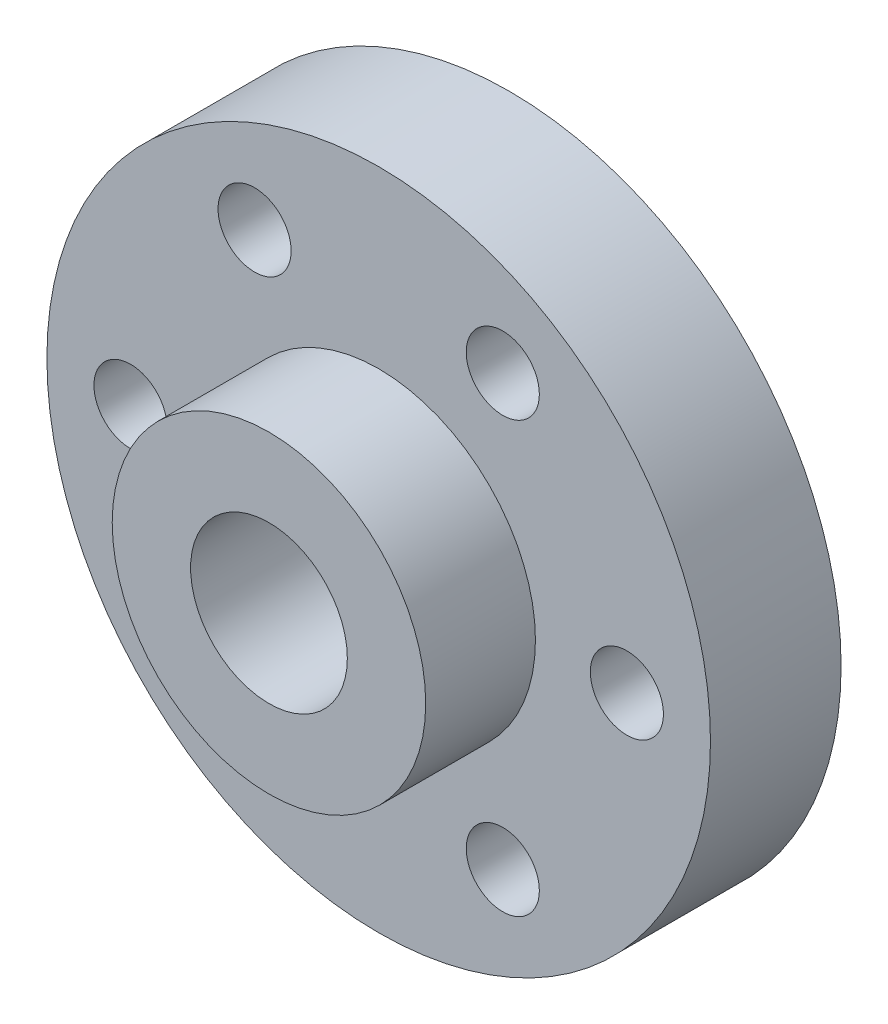
ISO-10303-21;
HEADER;
FILE_DESCRIPTION(('STEP AP214'),'2;1');
FILE_NAME('part.step','',(''),(''),'','','');
FILE_SCHEMA(('AUTOMOTIVE_DESIGN { 1 0 10303 214 1 1 1 1 }'));
ENDSEC;
DATA;
#1=APPLICATION_CONTEXT('core data for automotive mechanical design processes');
#2=APPLICATION_PROTOCOL_DEFINITION('international standard','automotive_design',2000,#1);
#3=PRODUCT_CONTEXT('',#1,'mechanical');
#4=PRODUCT('Part','Part','',(#3));
#5=PRODUCT_RELATED_PRODUCT_CATEGORY('part','',(#4));
#6=PRODUCT_DEFINITION_FORMATION('','',#4);
#7=PRODUCT_DEFINITION_CONTEXT('part definition',#1,'design');
#8=PRODUCT_DEFINITION('design','',#6,#7);
#9=PRODUCT_DEFINITION_SHAPE('','',#8);
#10=(LENGTH_UNIT() NAMED_UNIT(*) SI_UNIT(.MILLI.,.METRE.));
#11=(NAMED_UNIT(*) PLANE_ANGLE_UNIT() SI_UNIT($,.RADIAN.));
#12=(NAMED_UNIT(*) SI_UNIT($,.STERADIAN.) SOLID_ANGLE_UNIT());
#13=UNCERTAINTY_MEASURE_WITH_UNIT(LENGTH_MEASURE(1.E-05),#10,'distance_accuracy_value','');
#14=(GEOMETRIC_REPRESENTATION_CONTEXT(3) GLOBAL_UNCERTAINTY_ASSIGNED_CONTEXT((#13)) GLOBAL_UNIT_ASSIGNED_CONTEXT((#10,
#11,#12)) REPRESENTATION_CONTEXT('',''));
#15=CARTESIAN_POINT('',(0.,0.,0.));
#16=DIRECTION('',(0.,0.,1.));
#17=DIRECTION('',(1.,0.,0.));
#18=AXIS2_PLACEMENT_3D('',#15,#16,#17);
#19=CARTESIAN_POINT('',(9.5,0.,-5.));
#20=DIRECTION('',(0.,0.,1.));
#21=DIRECTION('',(1.,0.,0.));
#22=AXIS2_PLACEMENT_3D('',#19,#20,#21);
#23=CYLINDRICAL_SURFACE('',#22,1.39954);
#24=CARTESIAN_POINT('',(9.5,0.,-5.));
#25=DIRECTION('',(0.,0.,1.));
#26=DIRECTION('',(1.,0.,0.));
#27=AXIS2_PLACEMENT_3D('',#24,#25,#26);
#28=CIRCLE('',#27,1.39954);
#29=CARTESIAN_POINT('',(10.89954,0.,-5.));
#30=VERTEX_POINT('',#29);
#31=EDGE_CURVE('E39',#30,#30,#28,.T.);
#32=ORIENTED_EDGE('',*,*,#31,.F.);
#33=EDGE_LOOP('',(#32));
#34=FACE_BOUND('',#33,.T.);
#35=CARTESIAN_POINT('',(9.5,0.,0.));
#36=DIRECTION('',(0.,0.,1.));
#37=DIRECTION('',(1.,0.,0.));
#38=AXIS2_PLACEMENT_3D('',#35,#36,#37);
#39=CIRCLE('',#38,1.39954);
#40=CARTESIAN_POINT('',(10.89954,0.,0.));
#41=VERTEX_POINT('',#40);
#42=EDGE_CURVE('E64',#41,#41,#39,.T.);
#43=ORIENTED_EDGE('',*,*,#42,.T.);
#44=EDGE_LOOP('',(#43));
#45=FACE_BOUND('',#44,.T.);
#46=ADVANCED_FACE('F31',(#34,#45),#23,.F.);
#47=CARTESIAN_POINT('',(4.74999999999998,-8.22724133595218,-5.));
#48=DIRECTION('',(0.,0.,1.));
#49=DIRECTION('',(1.,0.,0.));
#50=AXIS2_PLACEMENT_3D('',#47,#48,#49);
#51=CYLINDRICAL_SURFACE('',#50,1.39954);
#52=CARTESIAN_POINT('',(4.74999999999998,-8.22724133595218,-5.));
#53=DIRECTION('',(0.,0.,1.));
#54=DIRECTION('',(1.,0.,0.));
#55=AXIS2_PLACEMENT_3D('',#52,#53,#54);
#56=CIRCLE('',#55,1.39954);
#57=CARTESIAN_POINT('',(6.14953999999998,-8.22724133595218,-5.));
#58=VERTEX_POINT('',#57);
#59=EDGE_CURVE('E44',#58,#58,#56,.T.);
#60=ORIENTED_EDGE('',*,*,#59,.F.);
#61=EDGE_LOOP('',(#60));
#62=FACE_BOUND('',#61,.T.);
#63=CARTESIAN_POINT('',(4.74999999999998,-8.22724133595218,0.));
#64=DIRECTION('',(0.,0.,1.));
#65=DIRECTION('',(1.,0.,0.));
#66=AXIS2_PLACEMENT_3D('',#63,#64,#65);
#67=CIRCLE('',#66,1.39954);
#68=CARTESIAN_POINT('',(6.14953999999998,-8.22724133595218,0.));
#69=VERTEX_POINT('',#68);
#70=EDGE_CURVE('E61',#69,#69,#67,.T.);
#71=ORIENTED_EDGE('',*,*,#70,.T.);
#72=EDGE_LOOP('',(#71));
#73=FACE_BOUND('',#72,.T.);
#74=ADVANCED_FACE('F95',(#62,#73),#51,.F.);
#75=CARTESIAN_POINT('',(-4.75000000000004,-8.22724133595215,-5.));
#76=DIRECTION('',(0.,0.,1.));
#77=DIRECTION('',(1.,0.,0.));
#78=AXIS2_PLACEMENT_3D('',#75,#76,#77);
#79=CYLINDRICAL_SURFACE('',#78,1.39954);
#80=CARTESIAN_POINT('',(-4.75000000000004,-8.22724133595215,-5.));
#81=DIRECTION('',(0.,0.,1.));
#82=DIRECTION('',(1.,0.,0.));
#83=AXIS2_PLACEMENT_3D('',#80,#81,#82);
#84=CIRCLE('',#83,1.39954);
#85=CARTESIAN_POINT('',(-3.35046000000004,-8.22724133595215,-5.));
#86=VERTEX_POINT('',#85);
#87=EDGE_CURVE('E87',#86,#86,#84,.T.);
#88=ORIENTED_EDGE('',*,*,#87,.F.);
#89=EDGE_LOOP('',(#88));
#90=FACE_BOUND('',#89,.T.);
#91=CARTESIAN_POINT('',(-4.75000000000004,-8.22724133595215,0.));
#92=DIRECTION('',(0.,0.,1.));
#93=DIRECTION('',(1.,0.,0.));
#94=AXIS2_PLACEMENT_3D('',#91,#92,#93);
#95=CIRCLE('',#94,1.39954);
#96=CARTESIAN_POINT('',(-3.35046000000004,-8.22724133595215,0.));
#97=VERTEX_POINT('',#96);
#98=EDGE_CURVE('E58',#97,#97,#95,.T.);
#99=ORIENTED_EDGE('',*,*,#98,.T.);
#100=EDGE_LOOP('',(#99));
#101=FACE_BOUND('',#100,.T.);
#102=ADVANCED_FACE('F98',(#90,#101),#79,.F.);
#103=CARTESIAN_POINT('',(-9.5,0.,-5.));
#104=DIRECTION('',(0.,0.,1.));
#105=DIRECTION('',(1.,0.,0.));
#106=AXIS2_PLACEMENT_3D('',#103,#104,#105);
#107=CYLINDRICAL_SURFACE('',#106,1.39954);
#108=CARTESIAN_POINT('',(-9.5,0.,-5.));
#109=DIRECTION('',(0.,0.,1.));
#110=DIRECTION('',(1.,0.,0.));
#111=AXIS2_PLACEMENT_3D('',#108,#109,#110);
#112=CIRCLE('',#111,1.39954);
#113=CARTESIAN_POINT('',(-8.10046,0.,-5.));
#114=VERTEX_POINT('',#113);
#115=EDGE_CURVE('E80',#114,#114,#112,.T.);
#116=ORIENTED_EDGE('',*,*,#115,.F.);
#117=EDGE_LOOP('',(#116));
#118=FACE_BOUND('',#117,.T.);
#119=CARTESIAN_POINT('',(-9.5,0.,0.));
#120=DIRECTION('',(0.,0.,1.));
#121=DIRECTION('',(1.,0.,0.));
#122=AXIS2_PLACEMENT_3D('',#119,#120,#121);
#123=CIRCLE('',#122,1.39954);
#124=CARTESIAN_POINT('',(-8.10046,0.,0.));
#125=VERTEX_POINT('',#124);
#126=EDGE_CURVE('E55',#125,#125,#123,.T.);
#127=ORIENTED_EDGE('',*,*,#126,.T.);
#128=EDGE_LOOP('',(#127));
#129=FACE_BOUND('',#128,.T.);
#130=ADVANCED_FACE('F122',(#118,#129),#107,.F.);
#131=CARTESIAN_POINT('',(-4.74999999999992,8.22724133595221,-5.));
#132=DIRECTION('',(0.,0.,1.));
#133=DIRECTION('',(1.,0.,0.));
#134=AXIS2_PLACEMENT_3D('',#131,#132,#133);
#135=CYLINDRICAL_SURFACE('',#134,1.39954);
#136=CARTESIAN_POINT('',(-4.74999999999992,8.22724133595221,-5.));
#137=DIRECTION('',(0.,0.,1.));
#138=DIRECTION('',(1.,0.,0.));
#139=AXIS2_PLACEMENT_3D('',#136,#137,#138);
#140=CIRCLE('',#139,1.39954);
#141=CARTESIAN_POINT('',(-3.35045999999992,8.22724133595221,-5.));
#142=VERTEX_POINT('',#141);
#143=EDGE_CURVE('E75',#142,#142,#140,.T.);
#144=ORIENTED_EDGE('',*,*,#143,.F.);
#145=EDGE_LOOP('',(#144));
#146=FACE_BOUND('',#145,.T.);
#147=CARTESIAN_POINT('',(-4.74999999999992,8.22724133595221,0.));
#148=DIRECTION('',(0.,0.,1.));
#149=DIRECTION('',(1.,0.,0.));
#150=AXIS2_PLACEMENT_3D('',#147,#148,#149);
#151=CIRCLE('',#150,1.39954);
#152=CARTESIAN_POINT('',(-3.35045999999992,8.22724133595221,0.));
#153=VERTEX_POINT('',#152);
#154=EDGE_CURVE('E51',#153,#153,#151,.T.);
#155=ORIENTED_EDGE('',*,*,#154,.T.);
#156=EDGE_LOOP('',(#155));
#157=FACE_BOUND('',#156,.T.);
#158=ADVANCED_FACE('F125',(#146,#157),#135,.F.);
#159=CARTESIAN_POINT('',(4.7500000000001,8.22724133595211,-5.));
#160=DIRECTION('',(0.,0.,1.));
#161=DIRECTION('',(1.,0.,0.));
#162=AXIS2_PLACEMENT_3D('',#159,#160,#161);
#163=CYLINDRICAL_SURFACE('',#162,1.39954);
#164=CARTESIAN_POINT('',(4.7500000000001,8.22724133595211,-5.));
#165=DIRECTION('',(0.,0.,1.));
#166=DIRECTION('',(1.,0.,0.));
#167=AXIS2_PLACEMENT_3D('',#164,#165,#166);
#168=CIRCLE('',#167,1.39954);
#169=CARTESIAN_POINT('',(6.1495400000001,8.22724133595211,-5.));
#170=VERTEX_POINT('',#169);
#171=EDGE_CURVE('E71',#170,#170,#168,.T.);
#172=ORIENTED_EDGE('',*,*,#171,.F.);
#173=EDGE_LOOP('',(#172));
#174=FACE_BOUND('',#173,.T.);
#175=CARTESIAN_POINT('',(4.7500000000001,8.22724133595211,0.));
#176=DIRECTION('',(0.,0.,1.));
#177=DIRECTION('',(1.,0.,0.));
#178=AXIS2_PLACEMENT_3D('',#175,#176,#177);
#179=CIRCLE('',#178,1.39954);
#180=CARTESIAN_POINT('',(6.1495400000001,8.22724133595211,0.));
#181=VERTEX_POINT('',#180);
#182=EDGE_CURVE('E48',#181,#181,#179,.T.);
#183=ORIENTED_EDGE('',*,*,#182,.T.);
#184=EDGE_LOOP('',(#183));
#185=FACE_BOUND('',#184,.T.);
#186=ADVANCED_FACE('F33',(#174,#185),#163,.F.);
#187=CARTESIAN_POINT('',(0.,0.,-5.));
#188=DIRECTION('',(0.,0.,1.));
#189=DIRECTION('',(1.,0.,0.));
#190=AXIS2_PLACEMENT_3D('',#187,#188,#189);
#191=CYLINDRICAL_SURFACE('',#190,12.7);
#192=CARTESIAN_POINT('',(0.,0.,-5.));
#193=DIRECTION('',(0.,0.,1.));
#194=DIRECTION('',(1.,0.,0.));
#195=AXIS2_PLACEMENT_3D('',#192,#193,#194);
#196=CIRCLE('',#195,12.7);
#197=CARTESIAN_POINT('',(12.7,0.,-5.));
#198=VERTEX_POINT('',#197);
#199=EDGE_CURVE('E10',#198,#198,#196,.T.);
#200=ORIENTED_EDGE('',*,*,#199,.T.);
#201=EDGE_LOOP('',(#200));
#202=FACE_BOUND('',#201,.T.);
#203=CARTESIAN_POINT('',(0.,0.,0.));
#204=DIRECTION('',(0.,0.,1.));
#205=DIRECTION('',(1.,0.,0.));
#206=AXIS2_PLACEMENT_3D('',#203,#204,#205);
#207=CIRCLE('',#206,12.7);
#208=CARTESIAN_POINT('',(12.7,0.,0.));
#209=VERTEX_POINT('',#208);
#210=EDGE_CURVE('E35',#209,#209,#207,.T.);
#211=ORIENTED_EDGE('',*,*,#210,.F.);
#212=EDGE_LOOP('',(#211));
#213=FACE_BOUND('',#212,.T.);
#214=ADVANCED_FACE('F118',(#202,#213),#191,.T.);
#215=CARTESIAN_POINT('',(0.,-28.0814213562373,-5.));
#216=DIRECTION('',(0.,0.,1.));
#217=DIRECTION('',(1.,0.,0.));
#218=AXIS2_PLACEMENT_3D('',#215,#216,#217);
#219=PLANE('',#218);
#220=ORIENTED_EDGE('',*,*,#171,.T.);
#221=EDGE_LOOP('',(#220));
#222=FACE_BOUND('',#221,.T.);
#223=ORIENTED_EDGE('',*,*,#143,.T.);
#224=EDGE_LOOP('',(#223));
#225=FACE_BOUND('',#224,.T.);
#226=ORIENTED_EDGE('',*,*,#115,.T.);
#227=EDGE_LOOP('',(#226));
#228=FACE_BOUND('',#227,.T.);
#229=ORIENTED_EDGE('',*,*,#87,.T.);
#230=EDGE_LOOP('',(#229));
#231=FACE_BOUND('',#230,.T.);
#232=ORIENTED_EDGE('',*,*,#59,.T.);
#233=EDGE_LOOP('',(#232));
#234=FACE_BOUND('',#233,.T.);
#235=ORIENTED_EDGE('',*,*,#31,.T.);
#236=EDGE_LOOP('',(#235));
#237=FACE_BOUND('',#236,.T.);
#238=ORIENTED_EDGE('',*,*,#199,.F.);
#239=EDGE_LOOP('',(#238));
#240=FACE_BOUND('',#239,.T.);
#241=CARTESIAN_POINT('',(0.,0.,-5.));
#242=DIRECTION('',(0.,0.,1.));
#243=DIRECTION('',(1.,0.,0.));
#244=AXIS2_PLACEMENT_3D('',#241,#242,#243);
#245=CIRCLE('',#244,3.);
#246=CARTESIAN_POINT('',(3.,0.,-5.));
#247=VERTEX_POINT('',#246);
#248=EDGE_CURVE('E52',#247,#247,#245,.T.);
#249=ORIENTED_EDGE('',*,*,#248,.T.);
#250=EDGE_LOOP('',(#249));
#251=FACE_BOUND('',#250,.T.);
#252=ADVANCED_FACE('F92',(#222,#225,#228,#231,#234,#237,#240,#251),#219,.F.);
#253=CARTESIAN_POINT('',(0.,-28.0814213562373,0.));
#254=DIRECTION('',(0.,0.,1.));
#255=DIRECTION('',(1.,0.,0.));
#256=AXIS2_PLACEMENT_3D('',#253,#254,#255);
#257=PLANE('',#256);
#258=ORIENTED_EDGE('',*,*,#182,.F.);
#259=EDGE_LOOP('',(#258));
#260=FACE_BOUND('',#259,.T.);
#261=ORIENTED_EDGE('',*,*,#154,.F.);
#262=EDGE_LOOP('',(#261));
#263=FACE_BOUND('',#262,.T.);
#264=ORIENTED_EDGE('',*,*,#126,.F.);
#265=EDGE_LOOP('',(#264));
#266=FACE_BOUND('',#265,.T.);
#267=ORIENTED_EDGE('',*,*,#98,.F.);
#268=EDGE_LOOP('',(#267));
#269=FACE_BOUND('',#268,.T.);
#270=ORIENTED_EDGE('',*,*,#70,.F.);
#271=EDGE_LOOP('',(#270));
#272=FACE_BOUND('',#271,.T.);
#273=ORIENTED_EDGE('',*,*,#42,.F.);
#274=EDGE_LOOP('',(#273));
#275=FACE_BOUND('',#274,.T.);
#276=CARTESIAN_POINT('',(0.,0.,0.));
#277=DIRECTION('',(0.,0.,1.));
#278=DIRECTION('',(1.,0.,0.));
#279=AXIS2_PLACEMENT_3D('',#276,#277,#278);
#280=CIRCLE('',#279,6.);
#281=CARTESIAN_POINT('',(6.,0.,0.));
#282=VERTEX_POINT('',#281);
#283=EDGE_CURVE('E66',#282,#282,#280,.T.);
#284=ORIENTED_EDGE('',*,*,#283,.F.);
#285=EDGE_LOOP('',(#284));
#286=FACE_BOUND('',#285,.T.);
#287=ORIENTED_EDGE('',*,*,#210,.T.);
#288=EDGE_LOOP('',(#287));
#289=FACE_BOUND('',#288,.T.);
#290=ADVANCED_FACE('F102',(#260,#263,#266,#269,#272,#275,#286,#289),#257,.T.);
#291=CARTESIAN_POINT('',(0.,0.,-5.));
#292=DIRECTION('',(0.,0.,1.));
#293=DIRECTION('',(1.,0.,0.));
#294=AXIS2_PLACEMENT_3D('',#291,#292,#293);
#295=CYLINDRICAL_SURFACE('',#294,3.);
#296=ORIENTED_EDGE('',*,*,#248,.F.);
#297=EDGE_LOOP('',(#296));
#298=FACE_BOUND('',#297,.T.);
#299=CARTESIAN_POINT('',(0.,0.,4.2));
#300=DIRECTION('',(0.,0.,1.));
#301=DIRECTION('',(1.,0.,0.));
#302=AXIS2_PLACEMENT_3D('',#299,#300,#301);
#303=CIRCLE('',#302,3.);
#304=CARTESIAN_POINT('',(3.,0.,4.2));
#305=VERTEX_POINT('',#304);
#306=EDGE_CURVE('E168',#305,#305,#303,.T.);
#307=ORIENTED_EDGE('',*,*,#306,.T.);
#308=EDGE_LOOP('',(#307));
#309=FACE_BOUND('',#308,.T.);
#310=ADVANCED_FACE('F105',(#298,#309),#295,.F.);
#311=CARTESIAN_POINT('',(0.,0.,-5.));
#312=DIRECTION('',(0.,0.,1.));
#313=DIRECTION('',(1.,0.,0.));
#314=AXIS2_PLACEMENT_3D('',#311,#312,#313);
#315=CYLINDRICAL_SURFACE('',#314,6.);
#316=ORIENTED_EDGE('',*,*,#283,.T.);
#317=EDGE_LOOP('',(#316));
#318=FACE_BOUND('',#317,.T.);
#319=CARTESIAN_POINT('',(0.,0.,4.2));
#320=DIRECTION('',(0.,0.,1.));
#321=DIRECTION('',(1.,0.,0.));
#322=AXIS2_PLACEMENT_3D('',#319,#320,#321);
#323=CIRCLE('',#322,6.);
#324=CARTESIAN_POINT('',(6.,0.,4.2));
#325=VERTEX_POINT('',#324);
#326=EDGE_CURVE('E171',#325,#325,#323,.T.);
#327=ORIENTED_EDGE('',*,*,#326,.F.);
#328=EDGE_LOOP('',(#327));
#329=FACE_BOUND('',#328,.T.);
#330=ADVANCED_FACE('F156',(#318,#329),#315,.T.);
#331=CARTESIAN_POINT('',(0.,-28.0814213562373,4.2));
#332=DIRECTION('',(0.,0.,1.));
#333=DIRECTION('',(1.,0.,0.));
#334=AXIS2_PLACEMENT_3D('',#331,#332,#333);
#335=PLANE('',#334);
#336=ORIENTED_EDGE('',*,*,#306,.F.);
#337=EDGE_LOOP('',(#336));
#338=FACE_BOUND('',#337,.T.);
#339=ORIENTED_EDGE('',*,*,#326,.T.);
#340=EDGE_LOOP('',(#339));
#341=FACE_BOUND('',#340,.T.);
#342=ADVANCED_FACE('F160',(#338,#341),#335,.T.);
#343=CLOSED_SHELL('',(#46,#74,#102,#130,#158,#186,#214,#252,#290,#310,#330,#342));
#344=MANIFOLD_SOLID_BREP('B2',#343);
#345=ADVANCED_BREP_SHAPE_REPRESENTATION('',(#18,#344),#14);
#346=SHAPE_DEFINITION_REPRESENTATION(#9,#345);
ENDSEC;
END-ISO-10303-21;
